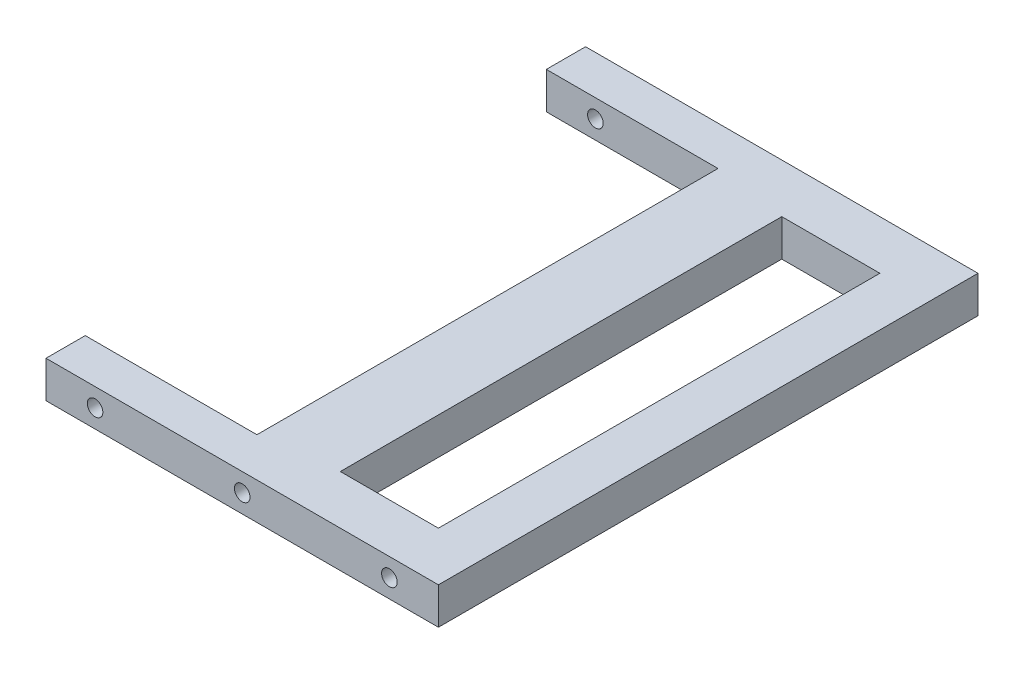
ISO-10303-21;
HEADER;
FILE_DESCRIPTION(('STEP AP214'),'2;1');
FILE_NAME('part.step','',(''),(''),'','','');
FILE_SCHEMA(('AUTOMOTIVE_DESIGN { 1 0 10303 214 1 1 1 1 }'));
ENDSEC;
DATA;
#1=APPLICATION_CONTEXT('core data for automotive mechanical design processes');
#2=APPLICATION_PROTOCOL_DEFINITION('international standard','automotive_design',2000,#1);
#3=PRODUCT_CONTEXT('',#1,'mechanical');
#4=PRODUCT('Part','Part','',(#3));
#5=PRODUCT_RELATED_PRODUCT_CATEGORY('part','',(#4));
#6=PRODUCT_DEFINITION_FORMATION('','',#4);
#7=PRODUCT_DEFINITION_CONTEXT('part definition',#1,'design');
#8=PRODUCT_DEFINITION('design','',#6,#7);
#9=PRODUCT_DEFINITION_SHAPE('','',#8);
#10=(LENGTH_UNIT() NAMED_UNIT(*) SI_UNIT(.MILLI.,.METRE.));
#11=(NAMED_UNIT(*) PLANE_ANGLE_UNIT() SI_UNIT($,.RADIAN.));
#12=(NAMED_UNIT(*) SI_UNIT($,.STERADIAN.) SOLID_ANGLE_UNIT());
#13=UNCERTAINTY_MEASURE_WITH_UNIT(LENGTH_MEASURE(1.E-05),#10,'distance_accuracy_value','');
#14=(GEOMETRIC_REPRESENTATION_CONTEXT(3) GLOBAL_UNCERTAINTY_ASSIGNED_CONTEXT((#13)) GLOBAL_UNIT_ASSIGNED_CONTEXT((#10,
#11,#12)) REPRESENTATION_CONTEXT('',''));
#15=CARTESIAN_POINT('',(0.,0.,0.));
#16=DIRECTION('',(0.,0.,1.));
#17=DIRECTION('',(1.,0.,0.));
#18=AXIS2_PLACEMENT_3D('',#15,#16,#17);
#19=CARTESIAN_POINT('',(-50.8,9.525,69.85));
#20=DIRECTION('',(1.,0.,0.));
#21=DIRECTION('',(0.,0.,-1.));
#22=AXIS2_PLACEMENT_3D('',#19,#20,#21);
#23=PLANE('',#22);
#24=DIRECTION('',(0.,0.,1.));
#25=VECTOR('',#24,1.);
#26=CARTESIAN_POINT('',(-50.8,0.,69.85));
#27=LINE('',#26,#25);
#28=CARTESIAN_POINT('',(-50.8,0.,-69.85));
#29=VERTEX_POINT('',#28);
#30=CARTESIAN_POINT('',(-50.8,0.,-59.69));
#31=VERTEX_POINT('',#30);
#32=EDGE_CURVE('E287',#29,#31,#27,.T.);
#33=ORIENTED_EDGE('',*,*,#32,.T.);
#34=DIRECTION('',(0.,1.,0.));
#35=VECTOR('',#34,1.);
#36=CARTESIAN_POINT('',(-50.8,0.,-59.69));
#37=LINE('',#36,#35);
#38=CARTESIAN_POINT('',(-50.8,9.525,-59.69));
#39=VERTEX_POINT('',#38);
#40=EDGE_CURVE('E224',#31,#39,#37,.T.);
#41=ORIENTED_EDGE('',*,*,#40,.T.);
#42=DIRECTION('',(0.,0.,1.));
#43=VECTOR('',#42,1.);
#44=CARTESIAN_POINT('',(-50.8,9.525,69.85));
#45=LINE('',#44,#43);
#46=CARTESIAN_POINT('',(-50.8,9.525,-69.85));
#47=VERTEX_POINT('',#46);
#48=EDGE_CURVE('E276',#47,#39,#45,.T.);
#49=ORIENTED_EDGE('',*,*,#48,.F.);
#50=DIRECTION('',(0.,-1.,0.));
#51=VECTOR('',#50,1.);
#52=CARTESIAN_POINT('',(-50.8,9.525,-69.85));
#53=LINE('',#52,#51);
#54=EDGE_CURVE('E296',#47,#29,#53,.T.);
#55=ORIENTED_EDGE('',*,*,#54,.T.);
#56=EDGE_LOOP('',(#33,#41,#49,#55));
#57=FACE_BOUND('',#56,.T.);
#58=ADVANCED_FACE('F36',(#57),#23,.F.);
#59=CARTESIAN_POINT('',(50.8,9.525,69.85));
#60=DIRECTION('',(-1.,0.,0.));
#61=DIRECTION('',(0.,0.,1.));
#62=AXIS2_PLACEMENT_3D('',#59,#60,#61);
#63=PLANE('',#62);
#64=DIRECTION('',(0.,0.,-1.));
#65=VECTOR('',#64,1.);
#66=CARTESIAN_POINT('',(50.8,0.,69.85));
#67=LINE('',#66,#65);
#68=CARTESIAN_POINT('',(50.8,0.,69.85));
#69=VERTEX_POINT('',#68);
#70=CARTESIAN_POINT('',(50.8,0.,-69.85));
#71=VERTEX_POINT('',#70);
#72=EDGE_CURVE('E260',#69,#71,#67,.T.);
#73=ORIENTED_EDGE('',*,*,#72,.T.);
#74=DIRECTION('',(0.,-1.,0.));
#75=VECTOR('',#74,1.);
#76=CARTESIAN_POINT('',(50.8,9.525,-69.85));
#77=LINE('',#76,#75);
#78=CARTESIAN_POINT('',(50.8,9.525,-69.85));
#79=VERTEX_POINT('',#78);
#80=EDGE_CURVE('E299',#79,#71,#77,.T.);
#81=ORIENTED_EDGE('',*,*,#80,.F.);
#82=DIRECTION('',(0.,0.,-1.));
#83=VECTOR('',#82,1.);
#84=CARTESIAN_POINT('',(50.8,9.525,69.85));
#85=LINE('',#84,#83);
#86=CARTESIAN_POINT('',(50.8,9.525,69.85));
#87=VERTEX_POINT('',#86);
#88=EDGE_CURVE('E269',#87,#79,#85,.T.);
#89=ORIENTED_EDGE('',*,*,#88,.F.);
#90=DIRECTION('',(0.,-1.,0.));
#91=VECTOR('',#90,1.);
#92=CARTESIAN_POINT('',(50.8,9.525,69.85));
#93=LINE('',#92,#91);
#94=EDGE_CURVE('E281',#87,#69,#93,.T.);
#95=ORIENTED_EDGE('',*,*,#94,.T.);
#96=EDGE_LOOP('',(#73,#81,#89,#95));
#97=FACE_BOUND('',#96,.T.);
#98=ADVANCED_FACE('F38',(#97),#63,.F.);
#99=CARTESIAN_POINT('',(-50.8,9.525,-69.85));
#100=DIRECTION('',(0.,0.,1.));
#101=DIRECTION('',(1.,0.,0.));
#102=AXIS2_PLACEMENT_3D('',#99,#100,#101);
#103=PLANE('',#102);
#104=CARTESIAN_POINT('',(38.1,4.7625,-69.85));
#105=DIRECTION('',(0.,0.,-1.));
#106=DIRECTION('',(-1.,0.,0.));
#107=AXIS2_PLACEMENT_3D('',#104,#105,#106);
#108=CIRCLE('',#107,2.01929999999999);
#109=CARTESIAN_POINT('',(36.0807,4.7625,-69.85));
#110=VERTEX_POINT('',#109);
#111=EDGE_CURVE('E186',#110,#110,#108,.T.);
#112=ORIENTED_EDGE('',*,*,#111,.F.);
#113=EDGE_LOOP('',(#112));
#114=FACE_BOUND('',#113,.T.);
#115=CARTESIAN_POINT('',(0.,4.7625,-69.85));
#116=DIRECTION('',(0.,0.,-1.));
#117=DIRECTION('',(-1.,0.,0.));
#118=AXIS2_PLACEMENT_3D('',#115,#116,#117);
#119=CIRCLE('',#118,2.01929999999999);
#120=CARTESIAN_POINT('',(-2.01929999999999,4.7625,-69.85));
#121=VERTEX_POINT('',#120);
#122=EDGE_CURVE('E194',#121,#121,#119,.T.);
#123=ORIENTED_EDGE('',*,*,#122,.F.);
#124=EDGE_LOOP('',(#123));
#125=FACE_BOUND('',#124,.T.);
#126=CARTESIAN_POINT('',(-38.1,4.7625,-69.85));
#127=DIRECTION('',(0.,0.,-1.));
#128=DIRECTION('',(-1.,0.,0.));
#129=AXIS2_PLACEMENT_3D('',#126,#127,#128);
#130=CIRCLE('',#129,2.01929999999999);
#131=CARTESIAN_POINT('',(-40.1193,4.7625,-69.85));
#132=VERTEX_POINT('',#131);
#133=EDGE_CURVE('E200',#132,#132,#130,.T.);
#134=ORIENTED_EDGE('',*,*,#133,.F.);
#135=EDGE_LOOP('',(#134));
#136=FACE_BOUND('',#135,.T.);
#137=DIRECTION('',(-1.,0.,0.));
#138=VECTOR('',#137,1.);
#139=CARTESIAN_POINT('',(-50.8,0.,-69.85));
#140=LINE('',#139,#138);
#141=EDGE_CURVE('E284',#71,#29,#140,.T.);
#142=ORIENTED_EDGE('',*,*,#141,.T.);
#143=ORIENTED_EDGE('',*,*,#54,.F.);
#144=DIRECTION('',(-1.,0.,0.));
#145=VECTOR('',#144,1.);
#146=CARTESIAN_POINT('',(-50.8,9.525,-69.85));
#147=LINE('',#146,#145);
#148=EDGE_CURVE('E272',#79,#47,#147,.T.);
#149=ORIENTED_EDGE('',*,*,#148,.F.);
#150=ORIENTED_EDGE('',*,*,#80,.T.);
#151=EDGE_LOOP('',(#142,#143,#149,#150));
#152=FACE_BOUND('',#151,.T.);
#153=ADVANCED_FACE('F344',(#114,#125,#136,#152),#103,.F.);
#154=CARTESIAN_POINT('',(-50.8,9.525,59.69));
#155=VERTEX_POINT('',#154);
#156=CARTESIAN_POINT('',(-50.8,9.525,69.85));
#157=VERTEX_POINT('',#156);
#158=EDGE_CURVE('E275',#155,#157,#45,.T.);
#159=ORIENTED_EDGE('',*,*,#158,.F.);
#160=DIRECTION('',(0.,1.,0.));
#161=VECTOR('',#160,1.);
#162=CARTESIAN_POINT('',(-50.8,0.,59.69));
#163=LINE('',#162,#161);
#164=CARTESIAN_POINT('',(-50.8,0.,59.69));
#165=VERTEX_POINT('',#164);
#166=EDGE_CURVE('E217',#165,#155,#163,.T.);
#167=ORIENTED_EDGE('',*,*,#166,.F.);
#168=CARTESIAN_POINT('',(-50.8,0.,69.85));
#169=VERTEX_POINT('',#168);
#170=EDGE_CURVE('E286',#165,#169,#27,.T.);
#171=ORIENTED_EDGE('',*,*,#170,.T.);
#172=DIRECTION('',(0.,-1.,0.));
#173=VECTOR('',#172,1.);
#174=CARTESIAN_POINT('',(-50.8,9.525,69.85));
#175=LINE('',#174,#173);
#176=EDGE_CURVE('E293',#157,#169,#175,.T.);
#177=ORIENTED_EDGE('',*,*,#176,.F.);
#178=EDGE_LOOP('',(#159,#167,#171,#177));
#179=FACE_BOUND('',#178,.T.);
#180=ADVANCED_FACE('F340',(#179),#23,.F.);
#181=CARTESIAN_POINT('',(-50.8,9.525,69.85));
#182=DIRECTION('',(0.,0.,-1.));
#183=DIRECTION('',(-1.,0.,0.));
#184=AXIS2_PLACEMENT_3D('',#181,#182,#183);
#185=PLANE('',#184);
#186=CARTESIAN_POINT('',(-38.1,4.7625,69.85));
#187=DIRECTION('',(0.,0.,1.));
#188=DIRECTION('',(1.,0.,0.));
#189=AXIS2_PLACEMENT_3D('',#186,#187,#188);
#190=CIRCLE('',#189,2.01929999999999);
#191=CARTESIAN_POINT('',(-36.0807,4.7625,69.85));
#192=VERTEX_POINT('',#191);
#193=EDGE_CURVE('E558',#192,#192,#190,.T.);
#194=ORIENTED_EDGE('',*,*,#193,.F.);
#195=EDGE_LOOP('',(#194));
#196=FACE_BOUND('',#195,.T.);
#197=CARTESIAN_POINT('',(0.,4.7625,69.85));
#198=DIRECTION('',(0.,0.,1.));
#199=DIRECTION('',(1.,0.,0.));
#200=AXIS2_PLACEMENT_3D('',#197,#198,#199);
#201=CIRCLE('',#200,2.01929999999999);
#202=CARTESIAN_POINT('',(2.01929999999999,4.7625,69.85));
#203=VERTEX_POINT('',#202);
#204=EDGE_CURVE('E172',#203,#203,#201,.T.);
#205=ORIENTED_EDGE('',*,*,#204,.F.);
#206=EDGE_LOOP('',(#205));
#207=FACE_BOUND('',#206,.T.);
#208=CARTESIAN_POINT('',(38.1,4.7625,69.85));
#209=DIRECTION('',(0.,0.,1.));
#210=DIRECTION('',(1.,0.,0.));
#211=AXIS2_PLACEMENT_3D('',#208,#209,#210);
#212=CIRCLE('',#211,2.01929999999999);
#213=CARTESIAN_POINT('',(40.1193,4.7625,69.85));
#214=VERTEX_POINT('',#213);
#215=EDGE_CURVE('E171',#214,#214,#212,.T.);
#216=ORIENTED_EDGE('',*,*,#215,.F.);
#217=EDGE_LOOP('',(#216));
#218=FACE_BOUND('',#217,.T.);
#219=DIRECTION('',(1.,0.,0.));
#220=VECTOR('',#219,1.);
#221=CARTESIAN_POINT('',(-50.8,0.,69.85));
#222=LINE('',#221,#220);
#223=EDGE_CURVE('E273',#169,#69,#222,.T.);
#224=ORIENTED_EDGE('',*,*,#223,.T.);
#225=ORIENTED_EDGE('',*,*,#94,.F.);
#226=DIRECTION('',(1.,0.,0.));
#227=VECTOR('',#226,1.);
#228=CARTESIAN_POINT('',(-50.8,9.525,69.85));
#229=LINE('',#228,#227);
#230=EDGE_CURVE('E279',#157,#87,#229,.T.);
#231=ORIENTED_EDGE('',*,*,#230,.F.);
#232=ORIENTED_EDGE('',*,*,#176,.T.);
#233=EDGE_LOOP('',(#224,#225,#231,#232));
#234=FACE_BOUND('',#233,.T.);
#235=ADVANCED_FACE('F348',(#196,#207,#218,#234),#185,.F.);
#236=CARTESIAN_POINT('',(50.8,9.525,-69.85));
#237=DIRECTION('',(0.,-1.,0.));
#238=DIRECTION('',(0.,0.,-1.));
#239=AXIS2_PLACEMENT_3D('',#236,#237,#238);
#240=PLANE('',#239);
#241=DIRECTION('',(-1.,0.,0.));
#242=VECTOR('',#241,1.);
#243=CARTESIAN_POINT('',(38.1,9.525,-57.15));
#244=LINE('',#243,#242);
#245=CARTESIAN_POINT('',(38.1,9.525,-57.15));
#246=VERTEX_POINT('',#245);
#247=CARTESIAN_POINT('',(12.7,9.525,-57.15));
#248=VERTEX_POINT('',#247);
#249=EDGE_CURVE('E249',#246,#248,#244,.T.);
#250=ORIENTED_EDGE('',*,*,#249,.F.);
#251=DIRECTION('',(0.,0.,-1.));
#252=VECTOR('',#251,1.);
#253=CARTESIAN_POINT('',(38.1,9.525,-57.15));
#254=LINE('',#253,#252);
#255=CARTESIAN_POINT('',(38.1,9.525,57.15));
#256=VERTEX_POINT('',#255);
#257=EDGE_CURVE('E227',#256,#246,#254,.T.);
#258=ORIENTED_EDGE('',*,*,#257,.F.);
#259=DIRECTION('',(1.,0.,0.));
#260=VECTOR('',#259,1.);
#261=CARTESIAN_POINT('',(38.1,9.525,57.15));
#262=LINE('',#261,#260);
#263=CARTESIAN_POINT('',(12.7,9.525,57.15));
#264=VERTEX_POINT('',#263);
#265=EDGE_CURVE('E237',#264,#256,#262,.T.);
#266=ORIENTED_EDGE('',*,*,#265,.F.);
#267=DIRECTION('',(0.,0.,1.));
#268=VECTOR('',#267,1.);
#269=CARTESIAN_POINT('',(12.7,9.525,-57.15));
#270=LINE('',#269,#268);
#271=EDGE_CURVE('E252',#248,#264,#270,.T.);
#272=ORIENTED_EDGE('',*,*,#271,.F.);
#273=EDGE_LOOP('',(#250,#258,#266,#272));
#274=FACE_BOUND('',#273,.T.);
#275=ORIENTED_EDGE('',*,*,#48,.T.);
#276=DIRECTION('',(-1.,0.,0.));
#277=VECTOR('',#276,1.);
#278=CARTESIAN_POINT('',(-50.8,9.525,-59.69));
#279=LINE('',#278,#277);
#280=CARTESIAN_POINT('',(-6.35000000000002,9.525,-59.69));
#281=VERTEX_POINT('',#280);
#282=EDGE_CURVE('E211',#281,#39,#279,.T.);
#283=ORIENTED_EDGE('',*,*,#282,.F.);
#284=DIRECTION('',(0.,0.,-1.));
#285=VECTOR('',#284,1.);
#286=CARTESIAN_POINT('',(-6.35000000000002,9.525,-59.69));
#287=LINE('',#286,#285);
#288=CARTESIAN_POINT('',(-6.35000000000002,9.525,59.69));
#289=VERTEX_POINT('',#288);
#290=EDGE_CURVE('E220',#289,#281,#287,.T.);
#291=ORIENTED_EDGE('',*,*,#290,.F.);
#292=DIRECTION('',(1.,0.,0.));
#293=VECTOR('',#292,1.);
#294=CARTESIAN_POINT('',(-50.8,9.525,59.69));
#295=LINE('',#294,#293);
#296=EDGE_CURVE('E206',#155,#289,#295,.T.);
#297=ORIENTED_EDGE('',*,*,#296,.F.);
#298=ORIENTED_EDGE('',*,*,#158,.T.);
#299=ORIENTED_EDGE('',*,*,#230,.T.);
#300=ORIENTED_EDGE('',*,*,#88,.T.);
#301=ORIENTED_EDGE('',*,*,#148,.T.);
#302=EDGE_LOOP('',(#275,#283,#291,#297,#298,#299,#300,#301));
#303=FACE_BOUND('',#302,.T.);
#304=ADVANCED_FACE('F354',(#274,#303),#240,.F.);
#305=CARTESIAN_POINT('',(50.8,0.,-69.85));
#306=DIRECTION('',(0.,-1.,0.));
#307=DIRECTION('',(0.,0.,-1.));
#308=AXIS2_PLACEMENT_3D('',#305,#306,#307);
#309=PLANE('',#308);
#310=DIRECTION('',(-1.,0.,0.));
#311=VECTOR('',#310,1.);
#312=CARTESIAN_POINT('',(-50.8,0.,-59.69));
#313=LINE('',#312,#311);
#314=CARTESIAN_POINT('',(-6.35000000000002,0.,-59.69));
#315=VERTEX_POINT('',#314);
#316=EDGE_CURVE('E214',#315,#31,#313,.T.);
#317=ORIENTED_EDGE('',*,*,#316,.T.);
#318=ORIENTED_EDGE('',*,*,#32,.F.);
#319=ORIENTED_EDGE('',*,*,#141,.F.);
#320=ORIENTED_EDGE('',*,*,#72,.F.);
#321=ORIENTED_EDGE('',*,*,#223,.F.);
#322=ORIENTED_EDGE('',*,*,#170,.F.);
#323=DIRECTION('',(1.,0.,0.));
#324=VECTOR('',#323,1.);
#325=CARTESIAN_POINT('',(-50.8,0.,59.69));
#326=LINE('',#325,#324);
#327=CARTESIAN_POINT('',(-6.35000000000002,0.,59.69));
#328=VERTEX_POINT('',#327);
#329=EDGE_CURVE('E207',#165,#328,#326,.T.);
#330=ORIENTED_EDGE('',*,*,#329,.T.);
#331=DIRECTION('',(0.,0.,-1.));
#332=VECTOR('',#331,1.);
#333=CARTESIAN_POINT('',(-6.35000000000002,0.,-59.69));
#334=LINE('',#333,#332);
#335=EDGE_CURVE('E210',#328,#315,#334,.T.);
#336=ORIENTED_EDGE('',*,*,#335,.T.);
#337=EDGE_LOOP('',(#317,#318,#319,#320,#321,#322,#330,#336));
#338=FACE_BOUND('',#337,.T.);
#339=DIRECTION('',(0.,0.,-1.));
#340=VECTOR('',#339,1.);
#341=CARTESIAN_POINT('',(38.1,0.,-57.15));
#342=LINE('',#341,#340);
#343=CARTESIAN_POINT('',(38.1,0.,57.15));
#344=VERTEX_POINT('',#343);
#345=CARTESIAN_POINT('',(38.1,0.,-57.15));
#346=VERTEX_POINT('',#345);
#347=EDGE_CURVE('E233',#344,#346,#342,.T.);
#348=ORIENTED_EDGE('',*,*,#347,.T.);
#349=DIRECTION('',(-1.,0.,0.));
#350=VECTOR('',#349,1.);
#351=CARTESIAN_POINT('',(38.1,0.,-57.15));
#352=LINE('',#351,#350);
#353=CARTESIAN_POINT('',(12.7,0.,-57.15));
#354=VERTEX_POINT('',#353);
#355=EDGE_CURVE('E236',#346,#354,#352,.T.);
#356=ORIENTED_EDGE('',*,*,#355,.T.);
#357=DIRECTION('',(0.,0.,1.));
#358=VECTOR('',#357,1.);
#359=CARTESIAN_POINT('',(12.7,0.,-57.15));
#360=LINE('',#359,#358);
#361=CARTESIAN_POINT('',(12.7,0.,57.15));
#362=VERTEX_POINT('',#361);
#363=EDGE_CURVE('E240',#354,#362,#360,.T.);
#364=ORIENTED_EDGE('',*,*,#363,.T.);
#365=DIRECTION('',(1.,0.,0.));
#366=VECTOR('',#365,1.);
#367=CARTESIAN_POINT('',(38.1,0.,57.15));
#368=LINE('',#367,#366);
#369=EDGE_CURVE('E243',#362,#344,#368,.T.);
#370=ORIENTED_EDGE('',*,*,#369,.T.);
#371=EDGE_LOOP('',(#348,#356,#364,#370));
#372=FACE_BOUND('',#371,.T.);
#373=ADVANCED_FACE('F371',(#338,#372),#309,.T.);
#374=CARTESIAN_POINT('',(38.1,0.,-57.15));
#375=DIRECTION('',(1.,0.,0.));
#376=DIRECTION('',(0.,0.,-1.));
#377=AXIS2_PLACEMENT_3D('',#374,#375,#376);
#378=PLANE('',#377);
#379=DIRECTION('',(0.,0.857167300702111,0.515038074910056));
#380=VECTOR('',#379,1.);
#381=CARTESIAN_POINT('',(38.1,4.7625,54.9206821519976));
#382=LINE('',#381,#380);
#383=CARTESIAN_POINT('',(38.1,4.7625,54.9206821519976));
#384=VERTEX_POINT('',#383);
#385=CARTESIAN_POINT('',(38.1,6.78179999999999,56.134));
#386=VERTEX_POINT('',#385);
#387=EDGE_CURVE('E51',#384,#386,#382,.T.);
#388=ORIENTED_EDGE('',*,*,#387,.T.);
#389=DIRECTION('',(0.,0.,1.));
#390=VECTOR('',#389,1.);
#391=CARTESIAN_POINT('',(38.1,6.78179999999999,69.85));
#392=LINE('',#391,#390);
#393=CARTESIAN_POINT('',(38.1,6.78179999999999,57.15));
#394=VERTEX_POINT('',#393);
#395=EDGE_CURVE('E11',#386,#394,#392,.T.);
#396=ORIENTED_EDGE('',*,*,#395,.T.);
#397=DIRECTION('',(0.,1.,0.));
#398=VECTOR('',#397,1.);
#399=CARTESIAN_POINT('',(38.1,0.,57.15));
#400=LINE('',#399,#398);
#401=EDGE_CURVE('E261',#394,#256,#400,.T.);
#402=ORIENTED_EDGE('',*,*,#401,.T.);
#403=ORIENTED_EDGE('',*,*,#257,.T.);
#404=DIRECTION('',(0.,1.,0.));
#405=VECTOR('',#404,1.);
#406=CARTESIAN_POINT('',(38.1,0.,-57.15));
#407=LINE('',#406,#405);
#408=CARTESIAN_POINT('',(38.1,6.78179999999999,-57.15));
#409=VERTEX_POINT('',#408);
#410=EDGE_CURVE('E246',#409,#246,#407,.T.);
#411=ORIENTED_EDGE('',*,*,#410,.F.);
#412=DIRECTION('',(0.,0.,-1.));
#413=VECTOR('',#412,1.);
#414=CARTESIAN_POINT('',(38.1,6.78179999999999,-69.85));
#415=LINE('',#414,#413);
#416=CARTESIAN_POINT('',(38.1,6.78179999999999,-56.134));
#417=VERTEX_POINT('',#416);
#418=EDGE_CURVE('E305',#409,#417,#415,.F.);
#419=ORIENTED_EDGE('',*,*,#418,.T.);
#420=DIRECTION('',(0.,-0.857167300702111,0.515038074910056));
#421=VECTOR('',#420,1.);
#422=CARTESIAN_POINT('',(38.1,4.7625,-54.9206821519976));
#423=LINE('',#422,#421);
#424=CARTESIAN_POINT('',(38.1,4.7625,-54.9206821519976));
#425=VERTEX_POINT('',#424);
#426=EDGE_CURVE('E302',#417,#425,#423,.T.);
#427=ORIENTED_EDGE('',*,*,#426,.T.);
#428=DIRECTION('',(0.,-0.857167300702111,-0.515038074910056));
#429=VECTOR('',#428,1.);
#430=CARTESIAN_POINT('',(38.1,4.7625,-54.9206821519976));
#431=LINE('',#430,#429);
#432=CARTESIAN_POINT('',(38.1,2.74320000000001,-56.134));
#433=VERTEX_POINT('',#432);
#434=EDGE_CURVE('E59',#425,#433,#431,.T.);
#435=ORIENTED_EDGE('',*,*,#434,.T.);
#436=DIRECTION('',(0.,0.,-1.));
#437=VECTOR('',#436,1.);
#438=CARTESIAN_POINT('',(38.1,2.74320000000001,-69.85));
#439=LINE('',#438,#437);
#440=CARTESIAN_POINT('',(38.1,2.74320000000001,-57.15));
#441=VERTEX_POINT('',#440);
#442=EDGE_CURVE('E308',#433,#441,#439,.T.);
#443=ORIENTED_EDGE('',*,*,#442,.T.);
#444=EDGE_CURVE('E266',#346,#441,#407,.T.);
#445=ORIENTED_EDGE('',*,*,#444,.F.);
#446=ORIENTED_EDGE('',*,*,#347,.F.);
#447=CARTESIAN_POINT('',(38.1,2.74320000000001,57.15));
#448=VERTEX_POINT('',#447);
#449=EDGE_CURVE('E257',#344,#448,#400,.T.);
#450=ORIENTED_EDGE('',*,*,#449,.T.);
#451=DIRECTION('',(0.,0.,1.));
#452=VECTOR('',#451,1.);
#453=CARTESIAN_POINT('',(38.1,2.74320000000001,69.85));
#454=LINE('',#453,#452);
#455=CARTESIAN_POINT('',(38.1,2.74320000000001,56.134));
#456=VERTEX_POINT('',#455);
#457=EDGE_CURVE('E44',#448,#456,#454,.F.);
#458=ORIENTED_EDGE('',*,*,#457,.T.);
#459=DIRECTION('',(0.,0.857167300702111,-0.515038074910056));
#460=VECTOR('',#459,1.);
#461=CARTESIAN_POINT('',(38.1,4.7625,54.9206821519976));
#462=LINE('',#461,#460);
#463=EDGE_CURVE('E311',#456,#384,#462,.T.);
#464=ORIENTED_EDGE('',*,*,#463,.T.);
#465=EDGE_LOOP('',(#388,#396,#402,#403,#411,#419,#427,#435,#443,#445,#446,#450,#458,#464));
#466=FACE_BOUND('',#465,.T.);
#467=ADVANCED_FACE('F315',(#466),#378,.F.);
#468=CARTESIAN_POINT('',(38.1,0.,57.15));
#469=DIRECTION('',(0.,0.,1.));
#470=DIRECTION('',(1.,0.,0.));
#471=AXIS2_PLACEMENT_3D('',#468,#469,#470);
#472=PLANE('',#471);
#473=ORIENTED_EDGE('',*,*,#401,.F.);
#474=CARTESIAN_POINT('',(38.1,4.7625,57.15));
#475=DIRECTION('',(0.,0.,1.));
#476=DIRECTION('',(1.,0.,0.));
#477=AXIS2_PLACEMENT_3D('',#474,#475,#476);
#478=CIRCLE('',#477,2.01929999999999);
#479=EDGE_CURVE('E183',#394,#448,#478,.T.);
#480=ORIENTED_EDGE('',*,*,#479,.T.);
#481=ORIENTED_EDGE('',*,*,#449,.F.);
#482=ORIENTED_EDGE('',*,*,#369,.F.);
#483=DIRECTION('',(0.,1.,0.));
#484=VECTOR('',#483,1.);
#485=CARTESIAN_POINT('',(12.7,0.,57.15));
#486=LINE('',#485,#484);
#487=EDGE_CURVE('E262',#362,#264,#486,.T.);
#488=ORIENTED_EDGE('',*,*,#487,.T.);
#489=ORIENTED_EDGE('',*,*,#265,.T.);
#490=EDGE_LOOP('',(#473,#480,#481,#482,#488,#489));
#491=FACE_BOUND('',#490,.T.);
#492=ADVANCED_FACE('F322',(#491),#472,.F.);
#493=CARTESIAN_POINT('',(12.7,0.,-57.15));
#494=DIRECTION('',(-1.,0.,0.));
#495=DIRECTION('',(0.,0.,1.));
#496=AXIS2_PLACEMENT_3D('',#493,#494,#495);
#497=PLANE('',#496);
#498=ORIENTED_EDGE('',*,*,#271,.T.);
#499=ORIENTED_EDGE('',*,*,#487,.F.);
#500=ORIENTED_EDGE('',*,*,#363,.F.);
#501=DIRECTION('',(0.,1.,0.));
#502=VECTOR('',#501,1.);
#503=CARTESIAN_POINT('',(12.7,0.,-57.15));
#504=LINE('',#503,#502);
#505=EDGE_CURVE('E264',#354,#248,#504,.T.);
#506=ORIENTED_EDGE('',*,*,#505,.T.);
#507=EDGE_LOOP('',(#498,#499,#500,#506));
#508=FACE_BOUND('',#507,.T.);
#509=ADVANCED_FACE('F403',(#508),#497,.F.);
#510=CARTESIAN_POINT('',(38.1,0.,-57.15));
#511=DIRECTION('',(0.,0.,-1.));
#512=DIRECTION('',(-1.,0.,0.));
#513=AXIS2_PLACEMENT_3D('',#510,#511,#512);
#514=PLANE('',#513);
#515=ORIENTED_EDGE('',*,*,#444,.T.);
#516=CARTESIAN_POINT('',(38.1,4.7625,-57.15));
#517=DIRECTION('',(0.,0.,-1.));
#518=DIRECTION('',(-1.,0.,0.));
#519=AXIS2_PLACEMENT_3D('',#516,#517,#518);
#520=CIRCLE('',#519,2.01929999999999);
#521=EDGE_CURVE('E191',#441,#409,#520,.T.);
#522=ORIENTED_EDGE('',*,*,#521,.T.);
#523=ORIENTED_EDGE('',*,*,#410,.T.);
#524=ORIENTED_EDGE('',*,*,#249,.T.);
#525=ORIENTED_EDGE('',*,*,#505,.F.);
#526=ORIENTED_EDGE('',*,*,#355,.F.);
#527=EDGE_LOOP('',(#515,#522,#523,#524,#525,#526));
#528=FACE_BOUND('',#527,.T.);
#529=ADVANCED_FACE('F396',(#528),#514,.F.);
#530=CARTESIAN_POINT('',(-50.8,0.,-59.69));
#531=DIRECTION('',(0.,0.,-1.));
#532=DIRECTION('',(-1.,0.,0.));
#533=AXIS2_PLACEMENT_3D('',#530,#531,#532);
#534=PLANE('',#533);
#535=CARTESIAN_POINT('',(-38.1,4.7625,-59.69));
#536=DIRECTION('',(0.,0.,-1.));
#537=DIRECTION('',(-1.,0.,0.));
#538=AXIS2_PLACEMENT_3D('',#535,#536,#537);
#539=CIRCLE('',#538,2.01929999999999);
#540=CARTESIAN_POINT('',(-40.1193,4.7625,-59.69));
#541=VERTEX_POINT('',#540);
#542=EDGE_CURVE('E203',#541,#541,#539,.T.);
#543=ORIENTED_EDGE('',*,*,#542,.T.);
#544=EDGE_LOOP('',(#543));
#545=FACE_BOUND('',#544,.T.);
#546=ORIENTED_EDGE('',*,*,#282,.T.);
#547=ORIENTED_EDGE('',*,*,#40,.F.);
#548=ORIENTED_EDGE('',*,*,#316,.F.);
#549=DIRECTION('',(0.,1.,0.));
#550=VECTOR('',#549,1.);
#551=CARTESIAN_POINT('',(-6.35000000000002,0.,-59.69));
#552=LINE('',#551,#550);
#553=EDGE_CURVE('E228',#315,#281,#552,.T.);
#554=ORIENTED_EDGE('',*,*,#553,.T.);
#555=EDGE_LOOP('',(#546,#547,#548,#554));
#556=FACE_BOUND('',#555,.T.);
#557=ADVANCED_FACE('F384',(#545,#556),#534,.F.);
#558=CARTESIAN_POINT('',(-6.35000000000002,0.,-59.69));
#559=DIRECTION('',(1.,0.,0.));
#560=DIRECTION('',(0.,0.,-1.));
#561=AXIS2_PLACEMENT_3D('',#558,#559,#560);
#562=PLANE('',#561);
#563=ORIENTED_EDGE('',*,*,#290,.T.);
#564=ORIENTED_EDGE('',*,*,#553,.F.);
#565=ORIENTED_EDGE('',*,*,#335,.F.);
#566=DIRECTION('',(0.,1.,0.));
#567=VECTOR('',#566,1.);
#568=CARTESIAN_POINT('',(-6.35000000000002,0.,59.69));
#569=LINE('',#568,#567);
#570=EDGE_CURVE('E230',#328,#289,#569,.T.);
#571=ORIENTED_EDGE('',*,*,#570,.T.);
#572=EDGE_LOOP('',(#563,#564,#565,#571));
#573=FACE_BOUND('',#572,.T.);
#574=ADVANCED_FACE('F386',(#573),#562,.F.);
#575=CARTESIAN_POINT('',(-50.8,0.,59.69));
#576=DIRECTION('',(0.,0.,1.));
#577=DIRECTION('',(1.,0.,0.));
#578=AXIS2_PLACEMENT_3D('',#575,#576,#577);
#579=PLANE('',#578);
#580=CARTESIAN_POINT('',(-38.1,4.7625,59.69));
#581=DIRECTION('',(0.,0.,1.));
#582=DIRECTION('',(1.,0.,0.));
#583=AXIS2_PLACEMENT_3D('',#580,#581,#582);
#584=CIRCLE('',#583,2.01929999999999);
#585=CARTESIAN_POINT('',(-36.0807,4.7625,59.69));
#586=VERTEX_POINT('',#585);
#587=EDGE_CURVE('E178',#586,#586,#584,.T.);
#588=ORIENTED_EDGE('',*,*,#587,.T.);
#589=EDGE_LOOP('',(#588));
#590=FACE_BOUND('',#589,.T.);
#591=ORIENTED_EDGE('',*,*,#296,.T.);
#592=ORIENTED_EDGE('',*,*,#570,.F.);
#593=ORIENTED_EDGE('',*,*,#329,.F.);
#594=ORIENTED_EDGE('',*,*,#166,.T.);
#595=EDGE_LOOP('',(#591,#592,#593,#594));
#596=FACE_BOUND('',#595,.T.);
#597=ADVANCED_FACE('F369',(#590,#596),#579,.F.);
#598=CARTESIAN_POINT('',(-38.1,4.7625,-69.85));
#599=DIRECTION('',(0.,0.,-1.));
#600=DIRECTION('',(-1.,0.,0.));
#601=AXIS2_PLACEMENT_3D('',#598,#599,#600);
#602=CYLINDRICAL_SURFACE('',#601,2.01929999999999);
#603=ORIENTED_EDGE('',*,*,#133,.T.);
#604=EDGE_LOOP('',(#603));
#605=FACE_BOUND('',#604,.T.);
#606=ORIENTED_EDGE('',*,*,#542,.F.);
#607=EDGE_LOOP('',(#606));
#608=FACE_BOUND('',#607,.T.);
#609=ADVANCED_FACE('F393',(#605,#608),#602,.F.);
#610=CARTESIAN_POINT('',(0.,4.7625,-56.134));
#611=DIRECTION('',(0.,0.,-1.));
#612=DIRECTION('',(-1.,0.,0.));
#613=AXIS2_PLACEMENT_3D('',#610,#611,#612);
#614=CONICAL_SURFACE('',#613,2.01929999999999,1.02974425867665);
#615=CARTESIAN_POINT('',(0.,4.7625,-54.9206821519976));
#616=VERTEX_POINT('',#615);
#617=VERTEX_LOOP('',#616);
#618=FACE_BOUND('',#617,.T.);
#619=CARTESIAN_POINT('',(0.,4.7625,-56.134));
#620=DIRECTION('',(0.,0.,-1.));
#621=DIRECTION('',(-1.,0.,0.));
#622=AXIS2_PLACEMENT_3D('',#619,#620,#621);
#623=CIRCLE('',#622,2.01929999999999);
#624=CARTESIAN_POINT('',(-2.01929999999999,4.7625,-56.134));
#625=VERTEX_POINT('',#624);
#626=EDGE_CURVE('E197',#625,#625,#623,.T.);
#627=ORIENTED_EDGE('',*,*,#626,.T.);
#628=EDGE_LOOP('',(#627));
#629=FACE_BOUND('',#628,.T.);
#630=ADVANCED_FACE('F458',(#618,#629),#614,.F.);
#631=CARTESIAN_POINT('',(0.,4.7625,-69.85));
#632=DIRECTION('',(0.,0.,-1.));
#633=DIRECTION('',(-1.,0.,0.));
#634=AXIS2_PLACEMENT_3D('',#631,#632,#633);
#635=CYLINDRICAL_SURFACE('',#634,2.01929999999999);
#636=ORIENTED_EDGE('',*,*,#626,.F.);
#637=EDGE_LOOP('',(#636));
#638=FACE_BOUND('',#637,.T.);
#639=ORIENTED_EDGE('',*,*,#122,.T.);
#640=EDGE_LOOP('',(#639));
#641=FACE_BOUND('',#640,.T.);
#642=ADVANCED_FACE('F469',(#638,#641),#635,.F.);
#643=CARTESIAN_POINT('',(38.1,4.7625,-69.85));
#644=DIRECTION('',(0.,0.,-1.));
#645=DIRECTION('',(-1.,0.,0.));
#646=AXIS2_PLACEMENT_3D('',#643,#644,#645);
#647=CYLINDRICAL_SURFACE('',#646,2.01929999999999);
#648=ORIENTED_EDGE('',*,*,#111,.T.);
#649=EDGE_LOOP('',(#648));
#650=FACE_BOUND('',#649,.T.);
#651=CARTESIAN_POINT('',(38.1,4.7625,-56.134));
#652=DIRECTION('',(0.,0.,-1.));
#653=DIRECTION('',(-1.,0.,0.));
#654=AXIS2_PLACEMENT_3D('',#651,#652,#653);
#655=CIRCLE('',#654,2.01929999999999);
#656=EDGE_CURVE('E189',#417,#433,#655,.T.);
#657=ORIENTED_EDGE('',*,*,#656,.F.);
#658=ORIENTED_EDGE('',*,*,#418,.F.);
#659=ORIENTED_EDGE('',*,*,#521,.F.);
#660=ORIENTED_EDGE('',*,*,#442,.F.);
#661=EDGE_LOOP('',(#657,#658,#659,#660));
#662=FACE_BOUND('',#661,.T.);
#663=ADVANCED_FACE('F479',(#650,#662),#647,.F.);
#664=CARTESIAN_POINT('',(38.1,4.7625,-56.134));
#665=DIRECTION('',(0.,0.,-1.));
#666=DIRECTION('',(-1.,0.,0.));
#667=AXIS2_PLACEMENT_3D('',#664,#665,#666);
#668=CONICAL_SURFACE('',#667,2.01929999999999,1.02974425867665);
#669=ORIENTED_EDGE('',*,*,#426,.F.);
#670=ORIENTED_EDGE('',*,*,#656,.T.);
#671=ORIENTED_EDGE('',*,*,#434,.F.);
#672=EDGE_LOOP('',(#669,#670,#671));
#673=FACE_BOUND('',#672,.T.);
#674=ADVANCED_FACE('F333',(#673),#668,.F.);
#675=CARTESIAN_POINT('',(38.1,4.7625,69.85));
#676=DIRECTION('',(0.,0.,1.));
#677=DIRECTION('',(1.,0.,0.));
#678=AXIS2_PLACEMENT_3D('',#675,#676,#677);
#679=CYLINDRICAL_SURFACE('',#678,2.01929999999999);
#680=ORIENTED_EDGE('',*,*,#215,.T.);
#681=EDGE_LOOP('',(#680));
#682=FACE_BOUND('',#681,.T.);
#683=CARTESIAN_POINT('',(38.1,4.7625,56.134));
#684=DIRECTION('',(0.,0.,1.));
#685=DIRECTION('',(1.,0.,0.));
#686=AXIS2_PLACEMENT_3D('',#683,#684,#685);
#687=CIRCLE('',#686,2.01929999999999);
#688=EDGE_CURVE('E175',#456,#386,#687,.T.);
#689=ORIENTED_EDGE('',*,*,#688,.F.);
#690=ORIENTED_EDGE('',*,*,#457,.F.);
#691=ORIENTED_EDGE('',*,*,#479,.F.);
#692=ORIENTED_EDGE('',*,*,#395,.F.);
#693=EDGE_LOOP('',(#689,#690,#691,#692));
#694=FACE_BOUND('',#693,.T.);
#695=ADVANCED_FACE('F319',(#682,#694),#679,.F.);
#696=CARTESIAN_POINT('',(38.1,4.7625,56.134));
#697=DIRECTION('',(0.,0.,1.));
#698=DIRECTION('',(1.,0.,0.));
#699=AXIS2_PLACEMENT_3D('',#696,#697,#698);
#700=CONICAL_SURFACE('',#699,2.01929999999999,1.02974425867665);
#701=ORIENTED_EDGE('',*,*,#463,.F.);
#702=ORIENTED_EDGE('',*,*,#688,.T.);
#703=ORIENTED_EDGE('',*,*,#387,.F.);
#704=EDGE_LOOP('',(#701,#702,#703));
#705=FACE_BOUND('',#704,.T.);
#706=ADVANCED_FACE('F165',(#705),#700,.F.);
#707=CARTESIAN_POINT('',(0.,4.7625,56.134));
#708=DIRECTION('',(0.,0.,1.));
#709=DIRECTION('',(1.,0.,0.));
#710=AXIS2_PLACEMENT_3D('',#707,#708,#709);
#711=CONICAL_SURFACE('',#710,2.01929999999999,1.02974425867665);
#712=CARTESIAN_POINT('',(0.,4.7625,54.9206821519976));
#713=VERTEX_POINT('',#712);
#714=VERTEX_LOOP('',#713);
#715=FACE_BOUND('',#714,.T.);
#716=CARTESIAN_POINT('',(0.,4.7625,56.134));
#717=DIRECTION('',(0.,0.,1.));
#718=DIRECTION('',(1.,0.,0.));
#719=AXIS2_PLACEMENT_3D('',#716,#717,#718);
#720=CIRCLE('',#719,2.01929999999999);
#721=CARTESIAN_POINT('',(2.01929999999999,4.7625,56.134));
#722=VERTEX_POINT('',#721);
#723=EDGE_CURVE('E169',#722,#722,#720,.T.);
#724=ORIENTED_EDGE('',*,*,#723,.T.);
#725=EDGE_LOOP('',(#724));
#726=FACE_BOUND('',#725,.T.);
#727=ADVANCED_FACE('F161',(#715,#726),#711,.F.);
#728=CARTESIAN_POINT('',(0.,4.7625,69.85));
#729=DIRECTION('',(0.,0.,1.));
#730=DIRECTION('',(1.,0.,0.));
#731=AXIS2_PLACEMENT_3D('',#728,#729,#730);
#732=CYLINDRICAL_SURFACE('',#731,2.01929999999999);
#733=ORIENTED_EDGE('',*,*,#723,.F.);
#734=EDGE_LOOP('',(#733));
#735=FACE_BOUND('',#734,.T.);
#736=ORIENTED_EDGE('',*,*,#204,.T.);
#737=EDGE_LOOP('',(#736));
#738=FACE_BOUND('',#737,.T.);
#739=ADVANCED_FACE('F164',(#735,#738),#732,.F.);
#740=CARTESIAN_POINT('',(-38.1,4.7625,69.85));
#741=DIRECTION('',(0.,0.,1.));
#742=DIRECTION('',(1.,0.,0.));
#743=AXIS2_PLACEMENT_3D('',#740,#741,#742);
#744=CYLINDRICAL_SURFACE('',#743,2.01929999999999);
#745=ORIENTED_EDGE('',*,*,#193,.T.);
#746=EDGE_LOOP('',(#745));
#747=FACE_BOUND('',#746,.T.);
#748=ORIENTED_EDGE('',*,*,#587,.F.);
#749=EDGE_LOOP('',(#748));
#750=FACE_BOUND('',#749,.T.);
#751=ADVANCED_FACE('F527',(#747,#750),#744,.F.);
#752=CLOSED_SHELL('',(#58,#98,#153,#180,#235,#304,#373,#467,#492,#509,#529,#557,#574,#597,#609,
#630,#642,#663,#674,#695,#706,#727,#739,#751));
#753=MANIFOLD_SOLID_BREP('B2',#752);
#754=ADVANCED_BREP_SHAPE_REPRESENTATION('',(#18,#753),#14);
#755=SHAPE_DEFINITION_REPRESENTATION(#9,#754);
ENDSEC;
END-ISO-10303-21;
